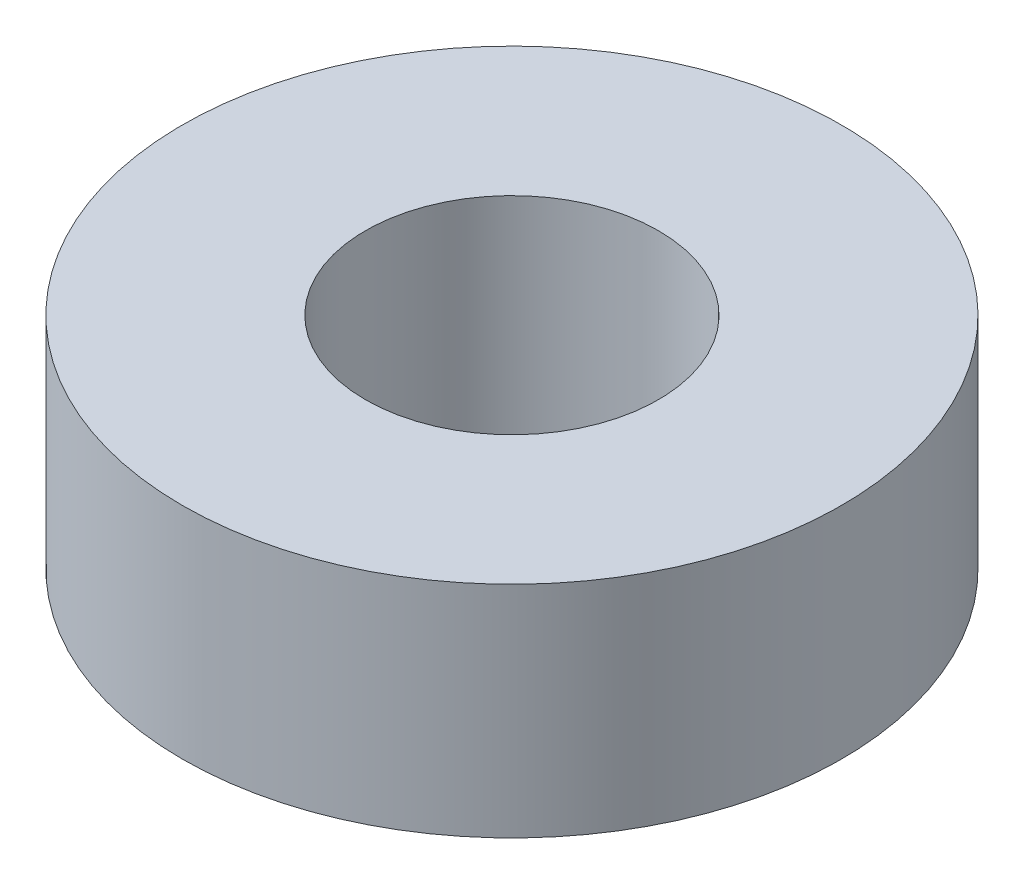
ISO-10303-21;
HEADER;
FILE_DESCRIPTION(('STEP AP214'),'2;1');
FILE_NAME('part.step','',(''),(''),'','','');
FILE_SCHEMA(('AUTOMOTIVE_DESIGN { 1 0 10303 214 1 1 1 1 }'));
ENDSEC;
DATA;
#1=APPLICATION_CONTEXT('core data for automotive mechanical design processes');
#2=APPLICATION_PROTOCOL_DEFINITION('international standard','automotive_design',2000,#1);
#3=PRODUCT_CONTEXT('',#1,'mechanical');
#4=PRODUCT('Part','Part','',(#3));
#5=PRODUCT_RELATED_PRODUCT_CATEGORY('part','',(#4));
#6=PRODUCT_DEFINITION_FORMATION('','',#4);
#7=PRODUCT_DEFINITION_CONTEXT('part definition',#1,'design');
#8=PRODUCT_DEFINITION('design','',#6,#7);
#9=PRODUCT_DEFINITION_SHAPE('','',#8);
#10=(LENGTH_UNIT() NAMED_UNIT(*) SI_UNIT(.MILLI.,.METRE.));
#11=(NAMED_UNIT(*) PLANE_ANGLE_UNIT() SI_UNIT($,.RADIAN.));
#12=(NAMED_UNIT(*) SI_UNIT($,.STERADIAN.) SOLID_ANGLE_UNIT());
#13=UNCERTAINTY_MEASURE_WITH_UNIT(LENGTH_MEASURE(1.E-05),#10,'distance_accuracy_value','');
#14=(GEOMETRIC_REPRESENTATION_CONTEXT(3) GLOBAL_UNCERTAINTY_ASSIGNED_CONTEXT((#13)) GLOBAL_UNIT_ASSIGNED_CONTEXT((#10,
#11,#12)) REPRESENTATION_CONTEXT('',''));
#15=CARTESIAN_POINT('',(0.,0.,0.));
#16=DIRECTION('',(0.,0.,1.));
#17=DIRECTION('',(1.,0.,0.));
#18=AXIS2_PLACEMENT_3D('',#15,#16,#17);
#19=CARTESIAN_POINT('',(0.,2.4,0.));
#20=DIRECTION('',(0.,1.,0.));
#21=DIRECTION('',(0.,0.,1.));
#22=AXIS2_PLACEMENT_3D('',#19,#20,#21);
#23=PLANE('',#22);
#24=CARTESIAN_POINT('',(0.,2.4,0.));
#25=DIRECTION('',(0.,1.,0.));
#26=DIRECTION('',(0.,0.,1.));
#27=AXIS2_PLACEMENT_3D('',#24,#25,#26);
#28=CIRCLE('',#27,3.6);
#29=CARTESIAN_POINT('',(0.,2.4,3.6));
#30=VERTEX_POINT('',#29);
#31=EDGE_CURVE('E10',#30,#30,#28,.T.);
#32=ORIENTED_EDGE('',*,*,#31,.T.);
#33=EDGE_LOOP('',(#32));
#34=FACE_BOUND('',#33,.T.);
#35=CARTESIAN_POINT('',(0.,2.4,0.));
#36=DIRECTION('',(0.,1.,0.));
#37=DIRECTION('',(0.,0.,1.));
#38=AXIS2_PLACEMENT_3D('',#35,#36,#37);
#39=CIRCLE('',#38,1.6);
#40=CARTESIAN_POINT('',(0.,2.4,1.6));
#41=VERTEX_POINT('',#40);
#42=EDGE_CURVE('E42',#41,#41,#39,.T.);
#43=ORIENTED_EDGE('',*,*,#42,.F.);
#44=EDGE_LOOP('',(#43));
#45=FACE_BOUND('',#44,.T.);
#46=ADVANCED_FACE('F31',(#34,#45),#23,.T.);
#47=CARTESIAN_POINT('',(0.,0.,0.));
#48=DIRECTION('',(0.,1.,0.));
#49=DIRECTION('',(0.,0.,1.));
#50=AXIS2_PLACEMENT_3D('',#47,#48,#49);
#51=PLANE('',#50);
#52=CARTESIAN_POINT('',(0.,0.,0.));
#53=DIRECTION('',(0.,1.,0.));
#54=DIRECTION('',(0.,0.,1.));
#55=AXIS2_PLACEMENT_3D('',#52,#53,#54);
#56=CIRCLE('',#55,3.6);
#57=CARTESIAN_POINT('',(0.,0.,3.6));
#58=VERTEX_POINT('',#57);
#59=EDGE_CURVE('E35',#58,#58,#56,.T.);
#60=ORIENTED_EDGE('',*,*,#59,.F.);
#61=EDGE_LOOP('',(#60));
#62=FACE_BOUND('',#61,.T.);
#63=CARTESIAN_POINT('',(0.,0.,0.));
#64=DIRECTION('',(0.,1.,0.));
#65=DIRECTION('',(0.,0.,1.));
#66=AXIS2_PLACEMENT_3D('',#63,#64,#65);
#67=CIRCLE('',#66,1.6);
#68=CARTESIAN_POINT('',(0.,0.,1.6));
#69=VERTEX_POINT('',#68);
#70=EDGE_CURVE('E44',#69,#69,#67,.T.);
#71=ORIENTED_EDGE('',*,*,#70,.T.);
#72=EDGE_LOOP('',(#71));
#73=FACE_BOUND('',#72,.T.);
#74=ADVANCED_FACE('F54',(#62,#73),#51,.F.);
#75=CARTESIAN_POINT('',(0.,2.4,0.));
#76=DIRECTION('',(0.,-1.,0.));
#77=DIRECTION('',(0.,0.,-1.));
#78=AXIS2_PLACEMENT_3D('',#75,#76,#77);
#79=CYLINDRICAL_SURFACE('',#78,3.6);
#80=ORIENTED_EDGE('',*,*,#31,.F.);
#81=EDGE_LOOP('',(#80));
#82=FACE_BOUND('',#81,.T.);
#83=ORIENTED_EDGE('',*,*,#59,.T.);
#84=EDGE_LOOP('',(#83));
#85=FACE_BOUND('',#84,.T.);
#86=ADVANCED_FACE('F33',(#82,#85),#79,.T.);
#87=CARTESIAN_POINT('',(0.,2.4,0.));
#88=DIRECTION('',(0.,-1.,0.));
#89=DIRECTION('',(0.,0.,-1.));
#90=AXIS2_PLACEMENT_3D('',#87,#88,#89);
#91=CYLINDRICAL_SURFACE('',#90,1.6);
#92=ORIENTED_EDGE('',*,*,#42,.T.);
#93=EDGE_LOOP('',(#92));
#94=FACE_BOUND('',#93,.T.);
#95=ORIENTED_EDGE('',*,*,#70,.F.);
#96=EDGE_LOOP('',(#95));
#97=FACE_BOUND('',#96,.T.);
#98=ADVANCED_FACE('F50',(#94,#97),#91,.F.);
#99=CLOSED_SHELL('',(#46,#74,#86,#98));
#100=MANIFOLD_SOLID_BREP('B2',#99);
#101=ADVANCED_BREP_SHAPE_REPRESENTATION('',(#18,#100),#14);
#102=SHAPE_DEFINITION_REPRESENTATION(#9,#101);
ENDSEC;
END-ISO-10303-21;
